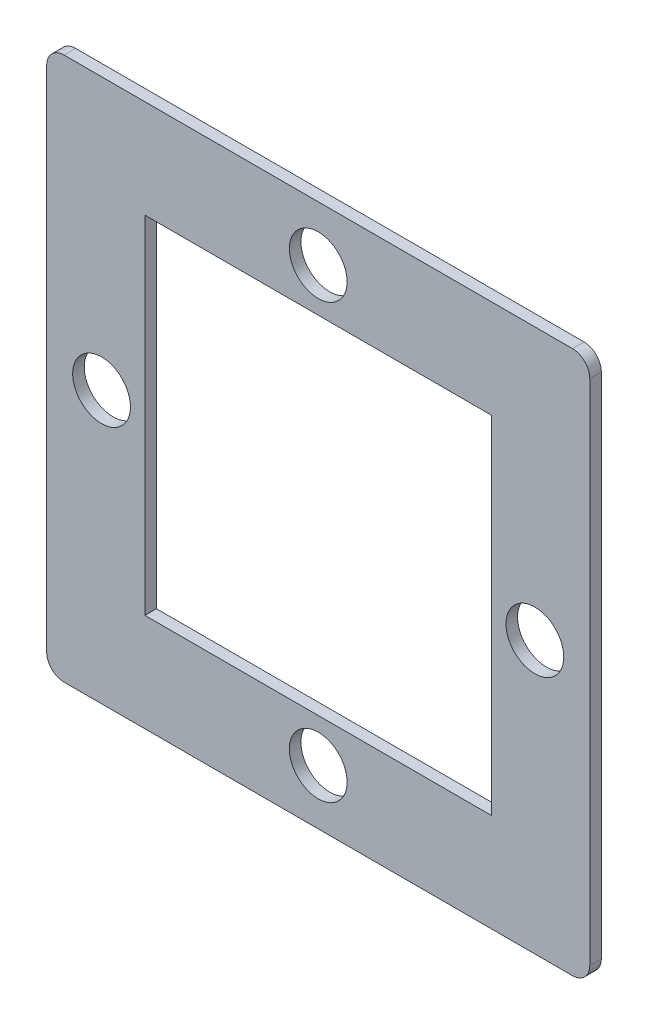
ISO-10303-21;
HEADER;
FILE_DESCRIPTION(('STEP AP214'),'2;1');
FILE_NAME('part.step','',(''),(''),'','','');
FILE_SCHEMA(('AUTOMOTIVE_DESIGN { 1 0 10303 214 1 1 1 1 }'));
ENDSEC;
DATA;
#1=APPLICATION_CONTEXT('core data for automotive mechanical design processes');
#2=APPLICATION_PROTOCOL_DEFINITION('international standard','automotive_design',2000,#1);
#3=PRODUCT_CONTEXT('',#1,'mechanical');
#4=PRODUCT('Part','Part','',(#3));
#5=PRODUCT_RELATED_PRODUCT_CATEGORY('part','',(#4));
#6=PRODUCT_DEFINITION_FORMATION('','',#4);
#7=PRODUCT_DEFINITION_CONTEXT('part definition',#1,'design');
#8=PRODUCT_DEFINITION('design','',#6,#7);
#9=PRODUCT_DEFINITION_SHAPE('','',#8);
#10=(LENGTH_UNIT() NAMED_UNIT(*) SI_UNIT(.MILLI.,.METRE.));
#11=(NAMED_UNIT(*) PLANE_ANGLE_UNIT() SI_UNIT($,.RADIAN.));
#12=(NAMED_UNIT(*) SI_UNIT($,.STERADIAN.) SOLID_ANGLE_UNIT());
#13=UNCERTAINTY_MEASURE_WITH_UNIT(LENGTH_MEASURE(1.E-05),#10,'distance_accuracy_value','');
#14=(GEOMETRIC_REPRESENTATION_CONTEXT(3) GLOBAL_UNCERTAINTY_ASSIGNED_CONTEXT((#13)) GLOBAL_UNIT_ASSIGNED_CONTEXT((#10,
#11,#12)) REPRESENTATION_CONTEXT('',''));
#15=CARTESIAN_POINT('',(0.,0.,0.));
#16=DIRECTION('',(0.,0.,1.));
#17=DIRECTION('',(1.,0.,0.));
#18=AXIS2_PLACEMENT_3D('',#15,#16,#17);
#19=CARTESIAN_POINT('',(0.,0.,1.));
#20=DIRECTION('',(0.,0.,-1.));
#21=DIRECTION('',(-1.,0.,0.));
#22=AXIS2_PLACEMENT_3D('',#19,#20,#21);
#23=PLANE('',#22);
#24=DIRECTION('',(0.,-1.,0.));
#25=VECTOR('',#24,1.);
#26=CARTESIAN_POINT('',(0.,0.,1.));
#27=LINE('',#26,#25);
#28=CARTESIAN_POINT('',(0.,45.5,1.));
#29=VERTEX_POINT('',#28);
#30=CARTESIAN_POINT('',(0.,1.5,1.));
#31=VERTEX_POINT('',#30);
#32=EDGE_CURVE('E186',#29,#31,#27,.T.);
#33=ORIENTED_EDGE('',*,*,#32,.T.);
#34=CARTESIAN_POINT('',(1.5,1.5,1.));
#35=DIRECTION('',(0.,0.,-1.));
#36=DIRECTION('',(-1.,0.,0.));
#37=AXIS2_PLACEMENT_3D('',#34,#35,#36);
#38=CIRCLE('',#37,1.5);
#39=CARTESIAN_POINT('',(1.5,0.,1.));
#40=VERTEX_POINT('',#39);
#41=EDGE_CURVE('E248',#31,#40,#38,.F.);
#42=ORIENTED_EDGE('',*,*,#41,.T.);
#43=DIRECTION('',(1.,0.,0.));
#44=VECTOR('',#43,1.);
#45=CARTESIAN_POINT('',(0.,0.,1.));
#46=LINE('',#45,#44);
#47=CARTESIAN_POINT('',(45.5,0.,1.));
#48=VERTEX_POINT('',#47);
#49=EDGE_CURVE('E190',#40,#48,#46,.T.);
#50=ORIENTED_EDGE('',*,*,#49,.T.);
#51=CARTESIAN_POINT('',(45.5,1.5,1.));
#52=DIRECTION('',(0.,0.,-1.));
#53=DIRECTION('',(-1.,0.,0.));
#54=AXIS2_PLACEMENT_3D('',#51,#52,#53);
#55=CIRCLE('',#54,1.5);
#56=CARTESIAN_POINT('',(47.,1.5,1.));
#57=VERTEX_POINT('',#56);
#58=EDGE_CURVE('E245',#48,#57,#55,.F.);
#59=ORIENTED_EDGE('',*,*,#58,.T.);
#60=DIRECTION('',(0.,1.,0.));
#61=VECTOR('',#60,1.);
#62=CARTESIAN_POINT('',(47.,0.,1.));
#63=LINE('',#62,#61);
#64=CARTESIAN_POINT('',(47.,45.5,1.));
#65=VERTEX_POINT('',#64);
#66=EDGE_CURVE('E195',#57,#65,#63,.T.);
#67=ORIENTED_EDGE('',*,*,#66,.T.);
#68=CARTESIAN_POINT('',(45.5,45.5,1.));
#69=DIRECTION('',(0.,0.,-1.));
#70=DIRECTION('',(-1.,0.,0.));
#71=AXIS2_PLACEMENT_3D('',#68,#69,#70);
#72=CIRCLE('',#71,1.5);
#73=CARTESIAN_POINT('',(45.5,47.,1.));
#74=VERTEX_POINT('',#73);
#75=EDGE_CURVE('E60',#65,#74,#72,.F.);
#76=ORIENTED_EDGE('',*,*,#75,.T.);
#77=DIRECTION('',(-1.,0.,0.));
#78=VECTOR('',#77,1.);
#79=CARTESIAN_POINT('',(0.,47.,1.));
#80=LINE('',#79,#78);
#81=CARTESIAN_POINT('',(1.49999999999999,47.,1.));
#82=VERTEX_POINT('',#81);
#83=EDGE_CURVE('E198',#74,#82,#80,.T.);
#84=ORIENTED_EDGE('',*,*,#83,.T.);
#85=CARTESIAN_POINT('',(1.49999999999999,45.5,1.));
#86=DIRECTION('',(0.,0.,-1.));
#87=DIRECTION('',(-1.,0.,0.));
#88=AXIS2_PLACEMENT_3D('',#85,#86,#87);
#89=CIRCLE('',#88,1.5);
#90=EDGE_CURVE('E240',#82,#29,#89,.F.);
#91=ORIENTED_EDGE('',*,*,#90,.T.);
#92=EDGE_LOOP('',(#33,#42,#50,#59,#67,#76,#84,#91));
#93=FACE_BOUND('',#92,.T.);
#94=DIRECTION('',(0.,-1.,0.));
#95=VECTOR('',#94,1.);
#96=CARTESIAN_POINT('',(8.49999999999999,38.5,1.));
#97=LINE('',#96,#95);
#98=CARTESIAN_POINT('',(8.49999999999999,38.5,1.));
#99=VERTEX_POINT('',#98);
#100=CARTESIAN_POINT('',(8.49999999999999,8.5,1.));
#101=VERTEX_POINT('',#100);
#102=EDGE_CURVE('E130',#99,#101,#97,.T.);
#103=ORIENTED_EDGE('',*,*,#102,.F.);
#104=DIRECTION('',(-1.,0.,0.));
#105=VECTOR('',#104,1.);
#106=CARTESIAN_POINT('',(8.49999999999999,38.5,1.));
#107=LINE('',#106,#105);
#108=CARTESIAN_POINT('',(38.5,38.5,1.));
#109=VERTEX_POINT('',#108);
#110=EDGE_CURVE('E160',#109,#99,#107,.T.);
#111=ORIENTED_EDGE('',*,*,#110,.F.);
#112=DIRECTION('',(0.,1.,0.));
#113=VECTOR('',#112,1.);
#114=CARTESIAN_POINT('',(38.5,38.5,1.));
#115=LINE('',#114,#113);
#116=CARTESIAN_POINT('',(38.5,8.5,1.));
#117=VERTEX_POINT('',#116);
#118=EDGE_CURVE('E156',#117,#109,#115,.T.);
#119=ORIENTED_EDGE('',*,*,#118,.F.);
#120=DIRECTION('',(1.,0.,0.));
#121=VECTOR('',#120,1.);
#122=CARTESIAN_POINT('',(8.49999999999999,8.5,1.));
#123=LINE('',#122,#121);
#124=EDGE_CURVE('E141',#101,#117,#123,.T.);
#125=ORIENTED_EDGE('',*,*,#124,.F.);
#126=EDGE_LOOP('',(#103,#111,#119,#125));
#127=FACE_BOUND('',#126,.T.);
#128=CARTESIAN_POINT('',(23.5,4.75,1.));
#129=DIRECTION('',(0.,0.,1.));
#130=DIRECTION('',(1.,0.,0.));
#131=AXIS2_PLACEMENT_3D('',#128,#129,#130);
#132=CIRCLE('',#131,2.5);
#133=CARTESIAN_POINT('',(26.,4.75,1.));
#134=VERTEX_POINT('',#133);
#135=EDGE_CURVE('E169',#134,#134,#132,.T.);
#136=ORIENTED_EDGE('',*,*,#135,.F.);
#137=EDGE_LOOP('',(#136));
#138=FACE_BOUND('',#137,.T.);
#139=CARTESIAN_POINT('',(42.25,23.5,1.));
#140=DIRECTION('',(0.,0.,1.));
#141=DIRECTION('',(1.,0.,0.));
#142=AXIS2_PLACEMENT_3D('',#139,#140,#141);
#143=CIRCLE('',#142,2.5);
#144=CARTESIAN_POINT('',(44.75,23.5,1.));
#145=VERTEX_POINT('',#144);
#146=EDGE_CURVE('E473',#145,#145,#143,.T.);
#147=ORIENTED_EDGE('',*,*,#146,.F.);
#148=EDGE_LOOP('',(#147));
#149=FACE_BOUND('',#148,.T.);
#150=CARTESIAN_POINT('',(23.5,42.25,1.));
#151=DIRECTION('',(0.,0.,1.));
#152=DIRECTION('',(1.,0.,0.));
#153=AXIS2_PLACEMENT_3D('',#150,#151,#152);
#154=CIRCLE('',#153,2.5);
#155=CARTESIAN_POINT('',(26.,42.25,1.));
#156=VERTEX_POINT('',#155);
#157=EDGE_CURVE('E466',#156,#156,#154,.T.);
#158=ORIENTED_EDGE('',*,*,#157,.F.);
#159=EDGE_LOOP('',(#158));
#160=FACE_BOUND('',#159,.T.);
#161=CARTESIAN_POINT('',(4.75,23.5,1.));
#162=DIRECTION('',(0.,0.,1.));
#163=DIRECTION('',(1.,0.,0.));
#164=AXIS2_PLACEMENT_3D('',#161,#162,#163);
#165=CIRCLE('',#164,2.5);
#166=CARTESIAN_POINT('',(7.25,23.5,1.));
#167=VERTEX_POINT('',#166);
#168=EDGE_CURVE('E459',#167,#167,#165,.T.);
#169=ORIENTED_EDGE('',*,*,#168,.F.);
#170=EDGE_LOOP('',(#169));
#171=FACE_BOUND('',#170,.T.);
#172=ADVANCED_FACE('F38',(#93,#127,#138,#149,#160,#171),#23,.F.);
#173=CARTESIAN_POINT('',(0.,0.,0.));
#174=DIRECTION('',(0.,0.,-1.));
#175=DIRECTION('',(-1.,0.,0.));
#176=AXIS2_PLACEMENT_3D('',#173,#174,#175);
#177=PLANE('',#176);
#178=CARTESIAN_POINT('',(23.5,42.25,0.));
#179=DIRECTION('',(0.,0.,1.));
#180=DIRECTION('',(1.,0.,0.));
#181=AXIS2_PLACEMENT_3D('',#178,#179,#180);
#182=CIRCLE('',#181,2.5);
#183=CARTESIAN_POINT('',(26.,42.25,0.));
#184=VERTEX_POINT('',#183);
#185=EDGE_CURVE('E463',#184,#184,#182,.T.);
#186=ORIENTED_EDGE('',*,*,#185,.T.);
#187=EDGE_LOOP('',(#186));
#188=FACE_BOUND('',#187,.T.);
#189=CARTESIAN_POINT('',(23.5,4.75,0.));
#190=DIRECTION('',(0.,0.,1.));
#191=DIRECTION('',(1.,0.,0.));
#192=AXIS2_PLACEMENT_3D('',#189,#190,#191);
#193=CIRCLE('',#192,2.5);
#194=CARTESIAN_POINT('',(26.,4.75,0.));
#195=VERTEX_POINT('',#194);
#196=EDGE_CURVE('E477',#195,#195,#193,.T.);
#197=ORIENTED_EDGE('',*,*,#196,.T.);
#198=EDGE_LOOP('',(#197));
#199=FACE_BOUND('',#198,.T.);
#200=DIRECTION('',(1.,0.,0.));
#201=VECTOR('',#200,1.);
#202=CARTESIAN_POINT('',(0.,0.,0.));
#203=LINE('',#202,#201);
#204=CARTESIAN_POINT('',(1.5,0.,0.));
#205=VERTEX_POINT('',#204);
#206=CARTESIAN_POINT('',(45.5,0.,0.));
#207=VERTEX_POINT('',#206);
#208=EDGE_CURVE('E205',#205,#207,#203,.T.);
#209=ORIENTED_EDGE('',*,*,#208,.F.);
#210=CARTESIAN_POINT('',(1.5,1.5,0.));
#211=DIRECTION('',(0.,0.,-1.));
#212=DIRECTION('',(-1.,0.,0.));
#213=AXIS2_PLACEMENT_3D('',#210,#211,#212);
#214=CIRCLE('',#213,1.5);
#215=CARTESIAN_POINT('',(0.,1.5,0.));
#216=VERTEX_POINT('',#215);
#217=EDGE_CURVE('E230',#205,#216,#214,.T.);
#218=ORIENTED_EDGE('',*,*,#217,.T.);
#219=DIRECTION('',(0.,-1.,0.));
#220=VECTOR('',#219,1.);
#221=CARTESIAN_POINT('',(0.,0.,0.));
#222=LINE('',#221,#220);
#223=CARTESIAN_POINT('',(0.,45.5,0.));
#224=VERTEX_POINT('',#223);
#225=EDGE_CURVE('E150',#224,#216,#222,.T.);
#226=ORIENTED_EDGE('',*,*,#225,.F.);
#227=CARTESIAN_POINT('',(1.49999999999999,45.5,0.));
#228=DIRECTION('',(0.,0.,-1.));
#229=DIRECTION('',(-1.,0.,0.));
#230=AXIS2_PLACEMENT_3D('',#227,#228,#229);
#231=CIRCLE('',#230,1.5);
#232=CARTESIAN_POINT('',(1.49999999999999,47.,0.));
#233=VERTEX_POINT('',#232);
#234=EDGE_CURVE('E221',#224,#233,#231,.T.);
#235=ORIENTED_EDGE('',*,*,#234,.T.);
#236=DIRECTION('',(-1.,0.,0.));
#237=VECTOR('',#236,1.);
#238=CARTESIAN_POINT('',(0.,47.,0.));
#239=LINE('',#238,#237);
#240=CARTESIAN_POINT('',(45.5,47.,0.));
#241=VERTEX_POINT('',#240);
#242=EDGE_CURVE('E191',#241,#233,#239,.T.);
#243=ORIENTED_EDGE('',*,*,#242,.F.);
#244=CARTESIAN_POINT('',(45.5,45.5,0.));
#245=DIRECTION('',(0.,0.,-1.));
#246=DIRECTION('',(-1.,0.,0.));
#247=AXIS2_PLACEMENT_3D('',#244,#245,#246);
#248=CIRCLE('',#247,1.5);
#249=CARTESIAN_POINT('',(47.,45.5,0.));
#250=VERTEX_POINT('',#249);
#251=EDGE_CURVE('E224',#241,#250,#248,.T.);
#252=ORIENTED_EDGE('',*,*,#251,.T.);
#253=DIRECTION('',(0.,1.,0.));
#254=VECTOR('',#253,1.);
#255=CARTESIAN_POINT('',(47.,0.,0.));
#256=LINE('',#255,#254);
#257=CARTESIAN_POINT('',(47.,1.5,0.));
#258=VERTEX_POINT('',#257);
#259=EDGE_CURVE('E209',#258,#250,#256,.T.);
#260=ORIENTED_EDGE('',*,*,#259,.F.);
#261=CARTESIAN_POINT('',(45.5,1.5,0.));
#262=DIRECTION('',(0.,0.,-1.));
#263=DIRECTION('',(-1.,0.,0.));
#264=AXIS2_PLACEMENT_3D('',#261,#262,#263);
#265=CIRCLE('',#264,1.5);
#266=EDGE_CURVE('E227',#258,#207,#265,.T.);
#267=ORIENTED_EDGE('',*,*,#266,.T.);
#268=EDGE_LOOP('',(#209,#218,#226,#235,#243,#252,#260,#267));
#269=FACE_BOUND('',#268,.T.);
#270=DIRECTION('',(-1.,0.,0.));
#271=VECTOR('',#270,1.);
#272=CARTESIAN_POINT('',(8.49999999999999,38.5,0.));
#273=LINE('',#272,#271);
#274=CARTESIAN_POINT('',(38.5,38.5,0.));
#275=VERTEX_POINT('',#274);
#276=CARTESIAN_POINT('',(8.49999999999999,38.5,0.));
#277=VERTEX_POINT('',#276);
#278=EDGE_CURVE('E142',#275,#277,#273,.T.);
#279=ORIENTED_EDGE('',*,*,#278,.T.);
#280=DIRECTION('',(0.,-1.,0.));
#281=VECTOR('',#280,1.);
#282=CARTESIAN_POINT('',(8.49999999999999,38.5,0.));
#283=LINE('',#282,#281);
#284=CARTESIAN_POINT('',(8.49999999999999,8.5,0.));
#285=VERTEX_POINT('',#284);
#286=EDGE_CURVE('E166',#277,#285,#283,.T.);
#287=ORIENTED_EDGE('',*,*,#286,.T.);
#288=DIRECTION('',(1.,0.,0.));
#289=VECTOR('',#288,1.);
#290=CARTESIAN_POINT('',(8.49999999999999,8.5,0.));
#291=LINE('',#290,#289);
#292=CARTESIAN_POINT('',(38.5,8.5,0.));
#293=VERTEX_POINT('',#292);
#294=EDGE_CURVE('E148',#285,#293,#291,.T.);
#295=ORIENTED_EDGE('',*,*,#294,.T.);
#296=DIRECTION('',(0.,1.,0.));
#297=VECTOR('',#296,1.);
#298=CARTESIAN_POINT('',(38.5,38.5,0.));
#299=LINE('',#298,#297);
#300=EDGE_CURVE('E172',#293,#275,#299,.T.);
#301=ORIENTED_EDGE('',*,*,#300,.T.);
#302=EDGE_LOOP('',(#279,#287,#295,#301));
#303=FACE_BOUND('',#302,.T.);
#304=CARTESIAN_POINT('',(42.25,23.5,0.));
#305=DIRECTION('',(0.,0.,1.));
#306=DIRECTION('',(1.,0.,0.));
#307=AXIS2_PLACEMENT_3D('',#304,#305,#306);
#308=CIRCLE('',#307,2.5);
#309=CARTESIAN_POINT('',(44.75,23.5,0.));
#310=VERTEX_POINT('',#309);
#311=EDGE_CURVE('E453',#310,#310,#308,.T.);
#312=ORIENTED_EDGE('',*,*,#311,.T.);
#313=EDGE_LOOP('',(#312));
#314=FACE_BOUND('',#313,.T.);
#315=CARTESIAN_POINT('',(4.75,23.5,0.));
#316=DIRECTION('',(0.,0.,1.));
#317=DIRECTION('',(1.,0.,0.));
#318=AXIS2_PLACEMENT_3D('',#315,#316,#317);
#319=CIRCLE('',#318,2.5);
#320=CARTESIAN_POINT('',(7.25,23.5,0.));
#321=VERTEX_POINT('',#320);
#322=EDGE_CURVE('E456',#321,#321,#319,.T.);
#323=ORIENTED_EDGE('',*,*,#322,.T.);
#324=EDGE_LOOP('',(#323));
#325=FACE_BOUND('',#324,.T.);
#326=ADVANCED_FACE('F268',(#188,#199,#269,#303,#314,#325),#177,.T.);
#327=CARTESIAN_POINT('',(0.,0.,1.));
#328=DIRECTION('',(1.,0.,0.));
#329=DIRECTION('',(0.,1.,0.));
#330=AXIS2_PLACEMENT_3D('',#327,#328,#329);
#331=PLANE('',#330);
#332=ORIENTED_EDGE('',*,*,#225,.T.);
#333=DIRECTION('',(0.,0.,-1.));
#334=VECTOR('',#333,1.);
#335=CARTESIAN_POINT('',(0.,1.5,1.));
#336=LINE('',#335,#334);
#337=EDGE_CURVE('E237',#216,#31,#336,.F.);
#338=ORIENTED_EDGE('',*,*,#337,.T.);
#339=ORIENTED_EDGE('',*,*,#32,.F.);
#340=DIRECTION('',(0.,0.,-1.));
#341=VECTOR('',#340,1.);
#342=CARTESIAN_POINT('',(0.,45.5,1.));
#343=LINE('',#342,#341);
#344=EDGE_CURVE('E233',#29,#224,#343,.T.);
#345=ORIENTED_EDGE('',*,*,#344,.T.);
#346=EDGE_LOOP('',(#332,#338,#339,#345));
#347=FACE_BOUND('',#346,.T.);
#348=ADVANCED_FACE('F281',(#347),#331,.F.);
#349=CARTESIAN_POINT('',(0.,0.,1.));
#350=DIRECTION('',(0.,1.,0.));
#351=DIRECTION('',(0.,0.,1.));
#352=AXIS2_PLACEMENT_3D('',#349,#350,#351);
#353=PLANE('',#352);
#354=ORIENTED_EDGE('',*,*,#49,.F.);
#355=DIRECTION('',(0.,0.,-1.));
#356=VECTOR('',#355,1.);
#357=CARTESIAN_POINT('',(1.5,0.,1.));
#358=LINE('',#357,#356);
#359=EDGE_CURVE('E217',#40,#205,#358,.T.);
#360=ORIENTED_EDGE('',*,*,#359,.T.);
#361=ORIENTED_EDGE('',*,*,#208,.T.);
#362=DIRECTION('',(0.,0.,-1.));
#363=VECTOR('',#362,1.);
#364=CARTESIAN_POINT('',(45.5,0.,1.));
#365=LINE('',#364,#363);
#366=EDGE_CURVE('E201',#207,#48,#365,.F.);
#367=ORIENTED_EDGE('',*,*,#366,.T.);
#368=EDGE_LOOP('',(#354,#360,#361,#367));
#369=FACE_BOUND('',#368,.T.);
#370=ADVANCED_FACE('F289',(#369),#353,.F.);
#371=CARTESIAN_POINT('',(47.,0.,1.));
#372=DIRECTION('',(-1.,0.,0.));
#373=DIRECTION('',(0.,-1.,0.));
#374=AXIS2_PLACEMENT_3D('',#371,#372,#373);
#375=PLANE('',#374);
#376=ORIENTED_EDGE('',*,*,#66,.F.);
#377=DIRECTION('',(0.,0.,-1.));
#378=VECTOR('',#377,1.);
#379=CARTESIAN_POINT('',(47.,1.5,1.));
#380=LINE('',#379,#378);
#381=EDGE_CURVE('E254',#57,#258,#380,.T.);
#382=ORIENTED_EDGE('',*,*,#381,.T.);
#383=ORIENTED_EDGE('',*,*,#259,.T.);
#384=DIRECTION('',(0.,0.,-1.));
#385=VECTOR('',#384,1.);
#386=CARTESIAN_POINT('',(47.,45.5,1.));
#387=LINE('',#386,#385);
#388=EDGE_CURVE('E251',#250,#65,#387,.F.);
#389=ORIENTED_EDGE('',*,*,#388,.T.);
#390=EDGE_LOOP('',(#376,#382,#383,#389));
#391=FACE_BOUND('',#390,.T.);
#392=ADVANCED_FACE('F262',(#391),#375,.F.);
#393=CARTESIAN_POINT('',(0.,47.,1.));
#394=DIRECTION('',(0.,-1.,0.));
#395=DIRECTION('',(0.,0.,-1.));
#396=AXIS2_PLACEMENT_3D('',#393,#394,#395);
#397=PLANE('',#396);
#398=ORIENTED_EDGE('',*,*,#83,.F.);
#399=DIRECTION('',(0.,0.,-1.));
#400=VECTOR('',#399,1.);
#401=CARTESIAN_POINT('',(45.5,47.,1.));
#402=LINE('',#401,#400);
#403=EDGE_CURVE('E11',#74,#241,#402,.T.);
#404=ORIENTED_EDGE('',*,*,#403,.T.);
#405=ORIENTED_EDGE('',*,*,#242,.T.);
#406=DIRECTION('',(0.,0.,-1.));
#407=VECTOR('',#406,1.);
#408=CARTESIAN_POINT('',(1.49999999999999,47.,1.));
#409=LINE('',#408,#407);
#410=EDGE_CURVE('E47',#233,#82,#409,.F.);
#411=ORIENTED_EDGE('',*,*,#410,.T.);
#412=EDGE_LOOP('',(#398,#404,#405,#411));
#413=FACE_BOUND('',#412,.T.);
#414=ADVANCED_FACE('F274',(#413),#397,.F.);
#415=CARTESIAN_POINT('',(8.49999999999999,38.5,1.));
#416=DIRECTION('',(1.,0.,0.));
#417=DIRECTION('',(0.,1.,0.));
#418=AXIS2_PLACEMENT_3D('',#415,#416,#417);
#419=PLANE('',#418);
#420=ORIENTED_EDGE('',*,*,#286,.F.);
#421=DIRECTION('',(0.,0.,-1.));
#422=VECTOR('',#421,1.);
#423=CARTESIAN_POINT('',(8.49999999999999,38.5,1.));
#424=LINE('',#423,#422);
#425=EDGE_CURVE('E136',#99,#277,#424,.T.);
#426=ORIENTED_EDGE('',*,*,#425,.F.);
#427=ORIENTED_EDGE('',*,*,#102,.T.);
#428=DIRECTION('',(0.,0.,-1.));
#429=VECTOR('',#428,1.);
#430=CARTESIAN_POINT('',(8.49999999999999,8.5,1.));
#431=LINE('',#430,#429);
#432=EDGE_CURVE('E133',#101,#285,#431,.T.);
#433=ORIENTED_EDGE('',*,*,#432,.T.);
#434=EDGE_LOOP('',(#420,#426,#427,#433));
#435=FACE_BOUND('',#434,.T.);
#436=ADVANCED_FACE('F132',(#435),#419,.T.);
#437=CARTESIAN_POINT('',(8.49999999999999,8.5,1.));
#438=DIRECTION('',(0.,1.,0.));
#439=DIRECTION('',(0.,0.,1.));
#440=AXIS2_PLACEMENT_3D('',#437,#438,#439);
#441=PLANE('',#440);
#442=ORIENTED_EDGE('',*,*,#294,.F.);
#443=ORIENTED_EDGE('',*,*,#432,.F.);
#444=ORIENTED_EDGE('',*,*,#124,.T.);
#445=DIRECTION('',(0.,0.,-1.));
#446=VECTOR('',#445,1.);
#447=CARTESIAN_POINT('',(38.5,8.5,1.));
#448=LINE('',#447,#446);
#449=EDGE_CURVE('E151',#117,#293,#448,.T.);
#450=ORIENTED_EDGE('',*,*,#449,.T.);
#451=EDGE_LOOP('',(#442,#443,#444,#450));
#452=FACE_BOUND('',#451,.T.);
#453=ADVANCED_FACE('F145',(#452),#441,.T.);
#454=CARTESIAN_POINT('',(38.5,38.5,1.));
#455=DIRECTION('',(-1.,0.,0.));
#456=DIRECTION('',(0.,-1.,0.));
#457=AXIS2_PLACEMENT_3D('',#454,#455,#456);
#458=PLANE('',#457);
#459=ORIENTED_EDGE('',*,*,#300,.F.);
#460=ORIENTED_EDGE('',*,*,#449,.F.);
#461=ORIENTED_EDGE('',*,*,#118,.T.);
#462=DIRECTION('',(0.,0.,-1.));
#463=VECTOR('',#462,1.);
#464=CARTESIAN_POINT('',(38.5,38.5,1.));
#465=LINE('',#464,#463);
#466=EDGE_CURVE('E181',#109,#275,#465,.T.);
#467=ORIENTED_EDGE('',*,*,#466,.T.);
#468=EDGE_LOOP('',(#459,#460,#461,#467));
#469=FACE_BOUND('',#468,.T.);
#470=ADVANCED_FACE('F395',(#469),#458,.T.);
#471=CARTESIAN_POINT('',(8.49999999999999,38.5,1.));
#472=DIRECTION('',(0.,-1.,0.));
#473=DIRECTION('',(0.,0.,-1.));
#474=AXIS2_PLACEMENT_3D('',#471,#472,#473);
#475=PLANE('',#474);
#476=ORIENTED_EDGE('',*,*,#278,.F.);
#477=ORIENTED_EDGE('',*,*,#466,.F.);
#478=ORIENTED_EDGE('',*,*,#110,.T.);
#479=ORIENTED_EDGE('',*,*,#425,.T.);
#480=EDGE_LOOP('',(#476,#477,#478,#479));
#481=FACE_BOUND('',#480,.T.);
#482=ADVANCED_FACE('F387',(#481),#475,.T.);
#483=CARTESIAN_POINT('',(23.5,4.75,1.));
#484=DIRECTION('',(0.,0.,-1.));
#485=DIRECTION('',(-1.,0.,0.));
#486=AXIS2_PLACEMENT_3D('',#483,#484,#485);
#487=CYLINDRICAL_SURFACE('',#486,2.5);
#488=ORIENTED_EDGE('',*,*,#135,.T.);
#489=EDGE_LOOP('',(#488));
#490=FACE_BOUND('',#489,.T.);
#491=ORIENTED_EDGE('',*,*,#196,.F.);
#492=EDGE_LOOP('',(#491));
#493=FACE_BOUND('',#492,.T.);
#494=ADVANCED_FACE('F379',(#490,#493),#487,.F.);
#495=CARTESIAN_POINT('',(42.25,23.5,1.));
#496=DIRECTION('',(0.,0.,-1.));
#497=DIRECTION('',(-1.,0.,0.));
#498=AXIS2_PLACEMENT_3D('',#495,#496,#497);
#499=CYLINDRICAL_SURFACE('',#498,2.5);
#500=ORIENTED_EDGE('',*,*,#146,.T.);
#501=EDGE_LOOP('',(#500));
#502=FACE_BOUND('',#501,.T.);
#503=ORIENTED_EDGE('',*,*,#311,.F.);
#504=EDGE_LOOP('',(#503));
#505=FACE_BOUND('',#504,.T.);
#506=ADVANCED_FACE('F371',(#502,#505),#499,.F.);
#507=CARTESIAN_POINT('',(23.5,42.25,1.));
#508=DIRECTION('',(0.,0.,-1.));
#509=DIRECTION('',(-1.,0.,0.));
#510=AXIS2_PLACEMENT_3D('',#507,#508,#509);
#511=CYLINDRICAL_SURFACE('',#510,2.5);
#512=ORIENTED_EDGE('',*,*,#157,.T.);
#513=EDGE_LOOP('',(#512));
#514=FACE_BOUND('',#513,.T.);
#515=ORIENTED_EDGE('',*,*,#185,.F.);
#516=EDGE_LOOP('',(#515));
#517=FACE_BOUND('',#516,.T.);
#518=ADVANCED_FACE('F364',(#514,#517),#511,.F.);
#519=CARTESIAN_POINT('',(4.75,23.5,1.));
#520=DIRECTION('',(0.,0.,-1.));
#521=DIRECTION('',(-1.,0.,0.));
#522=AXIS2_PLACEMENT_3D('',#519,#520,#521);
#523=CYLINDRICAL_SURFACE('',#522,2.5);
#524=ORIENTED_EDGE('',*,*,#168,.T.);
#525=EDGE_LOOP('',(#524));
#526=FACE_BOUND('',#525,.T.);
#527=ORIENTED_EDGE('',*,*,#322,.F.);
#528=EDGE_LOOP('',(#527));
#529=FACE_BOUND('',#528,.T.);
#530=ADVANCED_FACE('F298',(#526,#529),#523,.F.);
#531=CARTESIAN_POINT('',(1.5,1.5,1.));
#532=DIRECTION('',(0.,0.,-1.));
#533=DIRECTION('',(-1.,0.,0.));
#534=AXIS2_PLACEMENT_3D('',#531,#532,#533);
#535=CYLINDRICAL_SURFACE('',#534,1.5);
#536=ORIENTED_EDGE('',*,*,#41,.F.);
#537=ORIENTED_EDGE('',*,*,#337,.F.);
#538=ORIENTED_EDGE('',*,*,#217,.F.);
#539=ORIENTED_EDGE('',*,*,#359,.F.);
#540=EDGE_LOOP('',(#536,#537,#538,#539));
#541=FACE_BOUND('',#540,.T.);
#542=ADVANCED_FACE('F286',(#541),#535,.T.);
#543=CARTESIAN_POINT('',(45.5,1.5,1.));
#544=DIRECTION('',(0.,0.,-1.));
#545=DIRECTION('',(-1.,0.,0.));
#546=AXIS2_PLACEMENT_3D('',#543,#544,#545);
#547=CYLINDRICAL_SURFACE('',#546,1.5);
#548=ORIENTED_EDGE('',*,*,#58,.F.);
#549=ORIENTED_EDGE('',*,*,#366,.F.);
#550=ORIENTED_EDGE('',*,*,#266,.F.);
#551=ORIENTED_EDGE('',*,*,#381,.F.);
#552=EDGE_LOOP('',(#548,#549,#550,#551));
#553=FACE_BOUND('',#552,.T.);
#554=ADVANCED_FACE('F291',(#553),#547,.T.);
#555=CARTESIAN_POINT('',(45.5,45.5,1.));
#556=DIRECTION('',(0.,0.,-1.));
#557=DIRECTION('',(-1.,0.,0.));
#558=AXIS2_PLACEMENT_3D('',#555,#556,#557);
#559=CYLINDRICAL_SURFACE('',#558,1.5);
#560=ORIENTED_EDGE('',*,*,#75,.F.);
#561=ORIENTED_EDGE('',*,*,#388,.F.);
#562=ORIENTED_EDGE('',*,*,#251,.F.);
#563=ORIENTED_EDGE('',*,*,#403,.F.);
#564=EDGE_LOOP('',(#560,#561,#562,#563));
#565=FACE_BOUND('',#564,.T.);
#566=ADVANCED_FACE('F273',(#565),#559,.T.);
#567=CARTESIAN_POINT('',(1.49999999999999,45.5,1.));
#568=DIRECTION('',(0.,0.,-1.));
#569=DIRECTION('',(-1.,0.,0.));
#570=AXIS2_PLACEMENT_3D('',#567,#568,#569);
#571=CYLINDRICAL_SURFACE('',#570,1.5);
#572=ORIENTED_EDGE('',*,*,#90,.F.);
#573=ORIENTED_EDGE('',*,*,#410,.F.);
#574=ORIENTED_EDGE('',*,*,#234,.F.);
#575=ORIENTED_EDGE('',*,*,#344,.F.);
#576=EDGE_LOOP('',(#572,#573,#574,#575));
#577=FACE_BOUND('',#576,.T.);
#578=ADVANCED_FACE('F40',(#577),#571,.T.);
#579=CLOSED_SHELL('',(#172,#326,#348,#370,#392,#414,#436,#453,#470,#482,#494,#506,#518,#530,
#542,#554,#566,#578));
#580=MANIFOLD_SOLID_BREP('B2',#579);
#581=ADVANCED_BREP_SHAPE_REPRESENTATION('',(#18,#580),#14);
#582=SHAPE_DEFINITION_REPRESENTATION(#9,#581);
ENDSEC;
END-ISO-10303-21;
